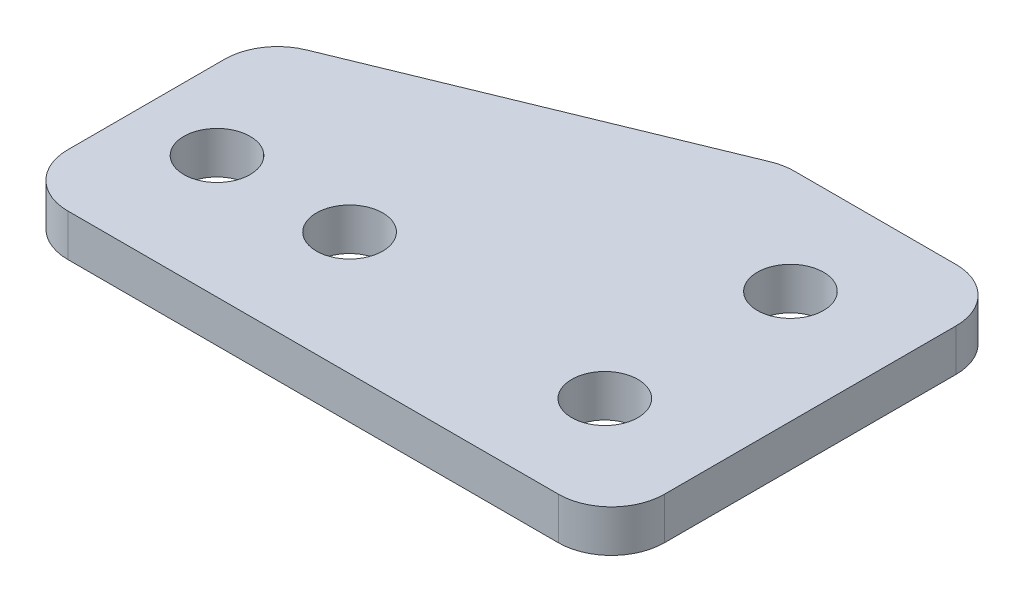
ISO-10303-21;
HEADER;
FILE_DESCRIPTION(('STEP AP214'),'2;1');
FILE_NAME('part.step','',(''),(''),'','','');
FILE_SCHEMA(('AUTOMOTIVE_DESIGN { 1 0 10303 214 1 1 1 1 }'));
ENDSEC;
DATA;
#1=APPLICATION_CONTEXT('core data for automotive mechanical design processes');
#2=APPLICATION_PROTOCOL_DEFINITION('international standard','automotive_design',2000,#1);
#3=PRODUCT_CONTEXT('',#1,'mechanical');
#4=PRODUCT('Part','Part','',(#3));
#5=PRODUCT_RELATED_PRODUCT_CATEGORY('part','',(#4));
#6=PRODUCT_DEFINITION_FORMATION('','',#4);
#7=PRODUCT_DEFINITION_CONTEXT('part definition',#1,'design');
#8=PRODUCT_DEFINITION('design','',#6,#7);
#9=PRODUCT_DEFINITION_SHAPE('','',#8);
#10=(LENGTH_UNIT() NAMED_UNIT(*) SI_UNIT(.MILLI.,.METRE.));
#11=(NAMED_UNIT(*) PLANE_ANGLE_UNIT() SI_UNIT($,.RADIAN.));
#12=(NAMED_UNIT(*) SI_UNIT($,.STERADIAN.) SOLID_ANGLE_UNIT());
#13=UNCERTAINTY_MEASURE_WITH_UNIT(LENGTH_MEASURE(1.E-05),#10,'distance_accuracy_value','');
#14=(GEOMETRIC_REPRESENTATION_CONTEXT(3) GLOBAL_UNCERTAINTY_ASSIGNED_CONTEXT((#13)) GLOBAL_UNIT_ASSIGNED_CONTEXT((#10,
#11,#12)) REPRESENTATION_CONTEXT('',''));
#15=CARTESIAN_POINT('',(0.,0.,0.));
#16=DIRECTION('',(0.,0.,1.));
#17=DIRECTION('',(1.,0.,0.));
#18=AXIS2_PLACEMENT_3D('',#15,#16,#17);
#19=CARTESIAN_POINT('',(-14.,143.175,155.));
#20=DIRECTION('',(0.,1.,0.));
#21=DIRECTION('',(0.,0.,-1.));
#22=AXIS2_PLACEMENT_3D('',#19,#20,#21);
#23=PLANE('',#22);
#24=CARTESIAN_POINT('',(-30.5,143.175,160.75));
#25=DIRECTION('',(0.,-1.,0.));
#26=DIRECTION('',(-1.,0.,0.));
#27=AXIS2_PLACEMENT_3D('',#24,#25,#26);
#28=CIRCLE('',#27,2.5);
#29=CARTESIAN_POINT('',(-28.,143.175,160.75));
#30=VERTEX_POINT('',#29);
#31=EDGE_CURVE('E232',#30,#30,#28,.T.);
#32=ORIENTED_EDGE('',*,*,#31,.T.);
#33=EDGE_LOOP('',(#32));
#34=FACE_BOUND('',#33,.T.);
#35=CARTESIAN_POINT('',(-20.5,143.175,160.75));
#36=DIRECTION('',(0.,-1.,0.));
#37=DIRECTION('',(-1.,0.,0.));
#38=AXIS2_PLACEMENT_3D('',#35,#36,#37);
#39=CIRCLE('',#38,2.5);
#40=CARTESIAN_POINT('',(-18.,143.175,160.75));
#41=VERTEX_POINT('',#40);
#42=EDGE_CURVE('E191',#41,#41,#39,.T.);
#43=ORIENTED_EDGE('',*,*,#42,.T.);
#44=EDGE_LOOP('',(#43));
#45=FACE_BOUND('',#44,.T.);
#46=CARTESIAN_POINT('',(-1.27675647831893E-13,143.175,162.));
#47=DIRECTION('',(0.,-1.,0.));
#48=DIRECTION('',(-1.,0.,0.));
#49=AXIS2_PLACEMENT_3D('',#46,#47,#48);
#50=CIRCLE('',#49,2.5);
#51=CARTESIAN_POINT('',(2.49999999999988,143.175,162.));
#52=VERTEX_POINT('',#51);
#53=EDGE_CURVE('E190',#52,#52,#50,.T.);
#54=ORIENTED_EDGE('',*,*,#53,.T.);
#55=EDGE_LOOP('',(#54));
#56=FACE_BOUND('',#55,.T.);
#57=CARTESIAN_POINT('',(-1.17683640610267E-13,143.175,148.));
#58=DIRECTION('',(0.,-1.,0.));
#59=DIRECTION('',(-1.,0.,0.));
#60=AXIS2_PLACEMENT_3D('',#57,#58,#59);
#61=CIRCLE('',#60,2.5);
#62=CARTESIAN_POINT('',(2.49999999999988,143.175,148.));
#63=VERTEX_POINT('',#62);
#64=EDGE_CURVE('E149',#63,#63,#61,.T.);
#65=ORIENTED_EDGE('',*,*,#64,.T.);
#66=EDGE_LOOP('',(#65));
#67=FACE_BOUND('',#66,.T.);
#68=CARTESIAN_POINT('',(4.49999999999987,143.175,144.));
#69=DIRECTION('',(0.,-1.,0.));
#70=DIRECTION('',(0.707106781186546,0.,-0.707106781186549));
#71=AXIS2_PLACEMENT_3D('',#68,#69,#70);
#72=CIRCLE('',#71,4.);
#73=CARTESIAN_POINT('',(4.49999999999987,143.175,140.));
#74=VERTEX_POINT('',#73);
#75=CARTESIAN_POINT('',(8.49999999999987,143.175,144.));
#76=VERTEX_POINT('',#75);
#77=EDGE_CURVE('E198',#74,#76,#72,.T.);
#78=ORIENTED_EDGE('',*,*,#77,.F.);
#79=DIRECTION('',(-1.,0.,0.));
#80=VECTOR('',#79,1.);
#81=CARTESIAN_POINT('',(-8.50000000000011,143.175,140.));
#82=LINE('',#81,#80);
#83=CARTESIAN_POINT('',(-7.71056635292856,143.175,140.));
#84=VERTEX_POINT('',#83);
#85=EDGE_CURVE('E196',#74,#84,#82,.T.);
#86=ORIENTED_EDGE('',*,*,#85,.T.);
#87=CARTESIAN_POINT('',(-7.71056635292856,143.175,144.));
#88=DIRECTION('',(0.,-1.,0.));
#89=DIRECTION('',(-0.193623580203377,0.,-0.98107589369489));
#90=AXIS2_PLACEMENT_3D('',#87,#88,#89);
#91=CIRCLE('',#90,4.);
#92=CARTESIAN_POINT('',(-9.23024176883602,143.175,140.299920726486));
#93=VERTEX_POINT('',#92);
#94=EDGE_CURVE('E219',#93,#84,#91,.T.);
#95=ORIENTED_EDGE('',*,*,#94,.F.);
#96=DIRECTION('',(-0.925019818378453,0.,0.379918853976865));
#97=VECTOR('',#96,1.);
#98=CARTESIAN_POINT('',(-36.5,143.175,151.5));
#99=LINE('',#98,#97);
#100=CARTESIAN_POINT('',(-34.0196754159076,143.175,150.481295260105));
#101=VERTEX_POINT('',#100);
#102=EDGE_CURVE('E167',#93,#101,#99,.T.);
#103=ORIENTED_EDGE('',*,*,#102,.T.);
#104=CARTESIAN_POINT('',(-32.5,143.175,154.181374533619));
#105=DIRECTION('',(0.,-1.,0.));
#106=DIRECTION('',(-0.830637963849734,0.,-0.556812870730883));
#107=AXIS2_PLACEMENT_3D('',#104,#105,#106);
#108=CIRCLE('',#107,4.);
#109=CARTESIAN_POINT('',(-36.5,143.175,154.181374533619));
#110=VERTEX_POINT('',#109);
#111=EDGE_CURVE('E171',#110,#101,#108,.T.);
#112=ORIENTED_EDGE('',*,*,#111,.F.);
#113=DIRECTION('',(0.,0.,1.));
#114=VECTOR('',#113,1.);
#115=CARTESIAN_POINT('',(-36.5,143.175,170.));
#116=LINE('',#115,#114);
#117=CARTESIAN_POINT('',(-36.5,143.175,166.));
#118=VERTEX_POINT('',#117);
#119=EDGE_CURVE('E203',#110,#118,#116,.T.);
#120=ORIENTED_EDGE('',*,*,#119,.T.);
#121=CARTESIAN_POINT('',(-32.5,143.175,166.));
#122=DIRECTION('',(0.,-1.,0.));
#123=DIRECTION('',(-0.707106781186549,0.,0.707106781186546));
#124=AXIS2_PLACEMENT_3D('',#121,#122,#123);
#125=CIRCLE('',#124,4.);
#126=CARTESIAN_POINT('',(-32.5,143.175,170.));
#127=VERTEX_POINT('',#126);
#128=EDGE_CURVE('E280',#127,#118,#125,.T.);
#129=ORIENTED_EDGE('',*,*,#128,.F.);
#130=DIRECTION('',(1.,0.,0.));
#131=VECTOR('',#130,1.);
#132=CARTESIAN_POINT('',(8.49999999999987,143.175,170.));
#133=LINE('',#132,#131);
#134=CARTESIAN_POINT('',(4.49999999999987,143.175,170.));
#135=VERTEX_POINT('',#134);
#136=EDGE_CURVE('E11',#127,#135,#133,.T.);
#137=ORIENTED_EDGE('',*,*,#136,.T.);
#138=CARTESIAN_POINT('',(4.49999999999987,143.175,166.));
#139=DIRECTION('',(0.,-1.,0.));
#140=DIRECTION('',(0.707106781186549,0.,0.707106781186546));
#141=AXIS2_PLACEMENT_3D('',#138,#139,#140);
#142=CIRCLE('',#141,4.);
#143=CARTESIAN_POINT('',(8.49999999999987,143.175,166.));
#144=VERTEX_POINT('',#143);
#145=EDGE_CURVE('E207',#144,#135,#142,.T.);
#146=ORIENTED_EDGE('',*,*,#145,.F.);
#147=DIRECTION('',(0.,0.,-1.));
#148=VECTOR('',#147,1.);
#149=CARTESIAN_POINT('',(8.49999999999987,143.175,140.));
#150=LINE('',#149,#148);
#151=EDGE_CURVE('E277',#144,#76,#150,.T.);
#152=ORIENTED_EDGE('',*,*,#151,.T.);
#153=EDGE_LOOP('',(#78,#86,#95,#103,#112,#120,#129,#137,#146,#152));
#154=FACE_BOUND('',#153,.T.);
#155=ADVANCED_FACE('F17',(#34,#45,#56,#67,#154),#23,.T.);
#156=CARTESIAN_POINT('',(-36.5,140.,170.));
#157=DIRECTION('',(0.,0.,1.));
#158=DIRECTION('',(1.,0.,0.));
#159=AXIS2_PLACEMENT_3D('',#156,#157,#158);
#160=PLANE('',#159);
#161=DIRECTION('',(0.,-1.,0.));
#162=VECTOR('',#161,1.);
#163=CARTESIAN_POINT('',(4.49999999999987,140.,170.));
#164=LINE('',#163,#162);
#165=CARTESIAN_POINT('',(4.49999999999987,140.,170.));
#166=VERTEX_POINT('',#165);
#167=EDGE_CURVE('E226',#135,#166,#164,.T.);
#168=ORIENTED_EDGE('',*,*,#167,.F.);
#169=ORIENTED_EDGE('',*,*,#136,.F.);
#170=DIRECTION('',(0.,1.,0.));
#171=VECTOR('',#170,1.);
#172=CARTESIAN_POINT('',(-32.5,140.,170.));
#173=LINE('',#172,#171);
#174=CARTESIAN_POINT('',(-32.5,140.,170.));
#175=VERTEX_POINT('',#174);
#176=EDGE_CURVE('E245',#175,#127,#173,.T.);
#177=ORIENTED_EDGE('',*,*,#176,.F.);
#178=DIRECTION('',(-1.,0.,0.));
#179=VECTOR('',#178,1.);
#180=CARTESIAN_POINT('',(8.49999999999987,140.,170.));
#181=LINE('',#180,#179);
#182=EDGE_CURVE('E178',#166,#175,#181,.T.);
#183=ORIENTED_EDGE('',*,*,#182,.F.);
#184=EDGE_LOOP('',(#168,#169,#177,#183));
#185=FACE_BOUND('',#184,.T.);
#186=ADVANCED_FACE('F311',(#185),#160,.T.);
#187=CARTESIAN_POINT('',(-1.17683640610267E-13,140.,148.));
#188=DIRECTION('',(0.,1.,0.));
#189=DIRECTION('',(-1.,0.,0.));
#190=AXIS2_PLACEMENT_3D('',#187,#188,#189);
#191=CYLINDRICAL_SURFACE('',#190,2.5);
#192=ORIENTED_EDGE('',*,*,#64,.F.);
#193=DIRECTION('',(0.,-1.,0.));
#194=VECTOR('',#193,1.);
#195=CARTESIAN_POINT('',(2.49999999999988,140.,148.));
#196=LINE('',#195,#194);
#197=CARTESIAN_POINT('',(2.49999999999988,140.,148.));
#198=VERTEX_POINT('',#197);
#199=EDGE_CURVE('E28',#63,#198,#196,.T.);
#200=ORIENTED_EDGE('',*,*,#199,.T.);
#201=CARTESIAN_POINT('',(-1.17683640610267E-13,140.,148.));
#202=DIRECTION('',(0.,-1.,0.));
#203=DIRECTION('',(-1.,0.,0.));
#204=AXIS2_PLACEMENT_3D('',#201,#202,#203);
#205=CIRCLE('',#204,2.5);
#206=EDGE_CURVE('E148',#198,#198,#205,.T.);
#207=ORIENTED_EDGE('',*,*,#206,.T.);
#208=ORIENTED_EDGE('',*,*,#199,.F.);
#209=EDGE_LOOP('',(#192,#200,#207,#208));
#210=FACE_BOUND('',#209,.T.);
#211=ADVANCED_FACE('F146',(#210),#191,.F.);
#212=CARTESIAN_POINT('',(-1.27675647831893E-13,140.,162.));
#213=DIRECTION('',(0.,1.,0.));
#214=DIRECTION('',(-1.,0.,0.));
#215=AXIS2_PLACEMENT_3D('',#212,#213,#214);
#216=CYLINDRICAL_SURFACE('',#215,2.5);
#217=ORIENTED_EDGE('',*,*,#53,.F.);
#218=DIRECTION('',(0.,-1.,0.));
#219=VECTOR('',#218,1.);
#220=CARTESIAN_POINT('',(2.49999999999988,140.,162.));
#221=LINE('',#220,#219);
#222=CARTESIAN_POINT('',(2.49999999999988,140.,162.));
#223=VERTEX_POINT('',#222);
#224=EDGE_CURVE('E142',#52,#223,#221,.T.);
#225=ORIENTED_EDGE('',*,*,#224,.T.);
#226=CARTESIAN_POINT('',(-1.27675647831893E-13,140.,162.));
#227=DIRECTION('',(0.,-1.,0.));
#228=DIRECTION('',(-1.,0.,0.));
#229=AXIS2_PLACEMENT_3D('',#226,#227,#228);
#230=CIRCLE('',#229,2.5);
#231=EDGE_CURVE('E251',#223,#223,#230,.T.);
#232=ORIENTED_EDGE('',*,*,#231,.T.);
#233=ORIENTED_EDGE('',*,*,#224,.F.);
#234=EDGE_LOOP('',(#217,#225,#232,#233));
#235=FACE_BOUND('',#234,.T.);
#236=ADVANCED_FACE('F417',(#235),#216,.F.);
#237=CARTESIAN_POINT('',(-20.5,140.,160.75));
#238=DIRECTION('',(0.,1.,0.));
#239=DIRECTION('',(-1.,0.,0.));
#240=AXIS2_PLACEMENT_3D('',#237,#238,#239);
#241=CYLINDRICAL_SURFACE('',#240,2.5);
#242=ORIENTED_EDGE('',*,*,#42,.F.);
#243=DIRECTION('',(0.,-1.,0.));
#244=VECTOR('',#243,1.);
#245=CARTESIAN_POINT('',(-18.,140.,160.75));
#246=LINE('',#245,#244);
#247=CARTESIAN_POINT('',(-18.,140.,160.75));
#248=VERTEX_POINT('',#247);
#249=EDGE_CURVE('E187',#41,#248,#246,.T.);
#250=ORIENTED_EDGE('',*,*,#249,.T.);
#251=CARTESIAN_POINT('',(-20.5,140.,160.75));
#252=DIRECTION('',(0.,-1.,0.));
#253=DIRECTION('',(-1.,0.,0.));
#254=AXIS2_PLACEMENT_3D('',#251,#252,#253);
#255=CIRCLE('',#254,2.5);
#256=EDGE_CURVE('E239',#248,#248,#255,.T.);
#257=ORIENTED_EDGE('',*,*,#256,.T.);
#258=ORIENTED_EDGE('',*,*,#249,.F.);
#259=EDGE_LOOP('',(#242,#250,#257,#258));
#260=FACE_BOUND('',#259,.T.);
#261=ADVANCED_FACE('F411',(#260),#241,.F.);
#262=CARTESIAN_POINT('',(-30.5,140.,160.75));
#263=DIRECTION('',(0.,1.,0.));
#264=DIRECTION('',(-1.,0.,0.));
#265=AXIS2_PLACEMENT_3D('',#262,#263,#264);
#266=CYLINDRICAL_SURFACE('',#265,2.5);
#267=ORIENTED_EDGE('',*,*,#31,.F.);
#268=DIRECTION('',(0.,-1.,0.));
#269=VECTOR('',#268,1.);
#270=CARTESIAN_POINT('',(-28.,140.,160.75));
#271=LINE('',#270,#269);
#272=CARTESIAN_POINT('',(-28.,140.,160.75));
#273=VERTEX_POINT('',#272);
#274=EDGE_CURVE('E229',#30,#273,#271,.T.);
#275=ORIENTED_EDGE('',*,*,#274,.T.);
#276=CARTESIAN_POINT('',(-30.5,140.,160.75));
#277=DIRECTION('',(0.,-1.,0.));
#278=DIRECTION('',(-1.,0.,0.));
#279=AXIS2_PLACEMENT_3D('',#276,#277,#278);
#280=CIRCLE('',#279,2.5);
#281=EDGE_CURVE('E235',#273,#273,#280,.T.);
#282=ORIENTED_EDGE('',*,*,#281,.T.);
#283=ORIENTED_EDGE('',*,*,#274,.F.);
#284=EDGE_LOOP('',(#267,#275,#282,#283));
#285=FACE_BOUND('',#284,.T.);
#286=ADVANCED_FACE('F416',(#285),#266,.F.);
#287=CARTESIAN_POINT('',(-32.5,140.,166.));
#288=DIRECTION('',(0.,1.,0.));
#289=DIRECTION('',(-0.707106781186549,0.,0.707106781186546));
#290=AXIS2_PLACEMENT_3D('',#287,#288,#289);
#291=CYLINDRICAL_SURFACE('',#290,4.);
#292=ORIENTED_EDGE('',*,*,#128,.T.);
#293=DIRECTION('',(0.,-1.,0.));
#294=VECTOR('',#293,1.);
#295=CARTESIAN_POINT('',(-36.5,140.,166.));
#296=LINE('',#295,#294);
#297=CARTESIAN_POINT('',(-36.5,140.,166.));
#298=VERTEX_POINT('',#297);
#299=EDGE_CURVE('E186',#118,#298,#296,.T.);
#300=ORIENTED_EDGE('',*,*,#299,.T.);
#301=CARTESIAN_POINT('',(-32.5,140.,166.));
#302=DIRECTION('',(0.,1.,0.));
#303=DIRECTION('',(-0.707106781186549,0.,0.707106781186546));
#304=AXIS2_PLACEMENT_3D('',#301,#302,#303);
#305=CIRCLE('',#304,4.);
#306=EDGE_CURVE('E173',#298,#175,#305,.T.);
#307=ORIENTED_EDGE('',*,*,#306,.T.);
#308=ORIENTED_EDGE('',*,*,#176,.T.);
#309=EDGE_LOOP('',(#292,#300,#307,#308));
#310=FACE_BOUND('',#309,.T.);
#311=ADVANCED_FACE('F19',(#310),#291,.T.);
#312=CARTESIAN_POINT('',(8.49999999999987,140.,170.));
#313=DIRECTION('',(1.,0.,0.));
#314=DIRECTION('',(0.,0.,-1.));
#315=AXIS2_PLACEMENT_3D('',#312,#313,#314);
#316=PLANE('',#315);
#317=DIRECTION('',(0.,-1.,0.));
#318=VECTOR('',#317,1.);
#319=CARTESIAN_POINT('',(8.49999999999987,140.,144.));
#320=LINE('',#319,#318);
#321=CARTESIAN_POINT('',(8.49999999999987,140.,144.));
#322=VERTEX_POINT('',#321);
#323=EDGE_CURVE('E202',#76,#322,#320,.T.);
#324=ORIENTED_EDGE('',*,*,#323,.F.);
#325=ORIENTED_EDGE('',*,*,#151,.F.);
#326=DIRECTION('',(0.,1.,0.));
#327=VECTOR('',#326,1.);
#328=CARTESIAN_POINT('',(8.49999999999987,140.,166.));
#329=LINE('',#328,#327);
#330=CARTESIAN_POINT('',(8.49999999999987,140.,166.));
#331=VERTEX_POINT('',#330);
#332=EDGE_CURVE('E159',#331,#144,#329,.T.);
#333=ORIENTED_EDGE('',*,*,#332,.F.);
#334=DIRECTION('',(0.,0.,1.));
#335=VECTOR('',#334,1.);
#336=CARTESIAN_POINT('',(8.49999999999987,140.,140.));
#337=LINE('',#336,#335);
#338=EDGE_CURVE('E255',#322,#331,#337,.T.);
#339=ORIENTED_EDGE('',*,*,#338,.F.);
#340=EDGE_LOOP('',(#324,#325,#333,#339));
#341=FACE_BOUND('',#340,.T.);
#342=ADVANCED_FACE('F318',(#341),#316,.T.);
#343=CARTESIAN_POINT('',(4.49999999999987,140.,166.));
#344=DIRECTION('',(0.,1.,0.));
#345=DIRECTION('',(0.707106781186549,0.,0.707106781186546));
#346=AXIS2_PLACEMENT_3D('',#343,#344,#345);
#347=CYLINDRICAL_SURFACE('',#346,4.);
#348=ORIENTED_EDGE('',*,*,#145,.T.);
#349=ORIENTED_EDGE('',*,*,#167,.T.);
#350=CARTESIAN_POINT('',(4.49999999999987,140.,166.));
#351=DIRECTION('',(0.,1.,0.));
#352=DIRECTION('',(0.707106781186549,0.,0.707106781186546));
#353=AXIS2_PLACEMENT_3D('',#350,#351,#352);
#354=CIRCLE('',#353,4.);
#355=EDGE_CURVE('E21',#166,#331,#354,.T.);
#356=ORIENTED_EDGE('',*,*,#355,.T.);
#357=ORIENTED_EDGE('',*,*,#332,.T.);
#358=EDGE_LOOP('',(#348,#349,#356,#357));
#359=FACE_BOUND('',#358,.T.);
#360=ADVANCED_FACE('F314',(#359),#347,.T.);
#361=CARTESIAN_POINT('',(-36.5,140.,151.5));
#362=DIRECTION('',(-1.,0.,0.));
#363=DIRECTION('',(0.,1.,0.));
#364=AXIS2_PLACEMENT_3D('',#361,#362,#363);
#365=PLANE('',#364);
#366=DIRECTION('',(0.,1.,0.));
#367=VECTOR('',#366,1.);
#368=CARTESIAN_POINT('',(-36.5,140.,154.181374533619));
#369=LINE('',#368,#367);
#370=CARTESIAN_POINT('',(-36.5,140.,154.181374533619));
#371=VERTEX_POINT('',#370);
#372=EDGE_CURVE('E182',#371,#110,#369,.T.);
#373=ORIENTED_EDGE('',*,*,#372,.F.);
#374=DIRECTION('',(0.,0.,-1.));
#375=VECTOR('',#374,1.);
#376=CARTESIAN_POINT('',(-36.5,140.,170.));
#377=LINE('',#376,#375);
#378=EDGE_CURVE('E177',#298,#371,#377,.T.);
#379=ORIENTED_EDGE('',*,*,#378,.F.);
#380=ORIENTED_EDGE('',*,*,#299,.F.);
#381=ORIENTED_EDGE('',*,*,#119,.F.);
#382=EDGE_LOOP('',(#373,#379,#380,#381));
#383=FACE_BOUND('',#382,.T.);
#384=ADVANCED_FACE('F308',(#383),#365,.T.);
#385=CARTESIAN_POINT('',(-32.5,140.,154.181374533619));
#386=DIRECTION('',(0.,1.,0.));
#387=DIRECTION('',(-0.830637963849734,0.,-0.556812870730883));
#388=AXIS2_PLACEMENT_3D('',#385,#386,#387);
#389=CYLINDRICAL_SURFACE('',#388,4.);
#390=ORIENTED_EDGE('',*,*,#111,.T.);
#391=DIRECTION('',(0.,-1.,0.));
#392=VECTOR('',#391,1.);
#393=CARTESIAN_POINT('',(-34.0196754159076,140.,150.481295260105));
#394=LINE('',#393,#392);
#395=CARTESIAN_POINT('',(-34.0196754159076,140.,150.481295260105));
#396=VERTEX_POINT('',#395);
#397=EDGE_CURVE('E172',#101,#396,#394,.T.);
#398=ORIENTED_EDGE('',*,*,#397,.T.);
#399=CARTESIAN_POINT('',(-32.5,140.,154.181374533619));
#400=DIRECTION('',(0.,1.,0.));
#401=DIRECTION('',(-0.830637963849734,0.,-0.556812870730883));
#402=AXIS2_PLACEMENT_3D('',#399,#400,#401);
#403=CIRCLE('',#402,4.);
#404=EDGE_CURVE('E166',#396,#371,#403,.T.);
#405=ORIENTED_EDGE('',*,*,#404,.T.);
#406=ORIENTED_EDGE('',*,*,#372,.T.);
#407=EDGE_LOOP('',(#390,#398,#405,#406));
#408=FACE_BOUND('',#407,.T.);
#409=ADVANCED_FACE('F387',(#408),#389,.T.);
#410=CARTESIAN_POINT('',(-8.50000000000011,140.,140.));
#411=DIRECTION('',(-0.379918853976865,0.,-0.925019818378453));
#412=DIRECTION('',(-0.925019818378453,0.,0.379918853976865));
#413=AXIS2_PLACEMENT_3D('',#410,#411,#412);
#414=PLANE('',#413);
#415=DIRECTION('',(0.,1.,0.));
#416=VECTOR('',#415,1.);
#417=CARTESIAN_POINT('',(-9.23024176883602,140.,140.299920726486));
#418=LINE('',#417,#416);
#419=CARTESIAN_POINT('',(-9.23024176883602,140.,140.299920726486));
#420=VERTEX_POINT('',#419);
#421=EDGE_CURVE('E215',#420,#93,#418,.T.);
#422=ORIENTED_EDGE('',*,*,#421,.F.);
#423=DIRECTION('',(0.925019818378453,0.,-0.379918853976865));
#424=VECTOR('',#423,1.);
#425=CARTESIAN_POINT('',(-36.5,140.,151.5));
#426=LINE('',#425,#424);
#427=EDGE_CURVE('E161',#396,#420,#426,.T.);
#428=ORIENTED_EDGE('',*,*,#427,.F.);
#429=ORIENTED_EDGE('',*,*,#397,.F.);
#430=ORIENTED_EDGE('',*,*,#102,.F.);
#431=EDGE_LOOP('',(#422,#428,#429,#430));
#432=FACE_BOUND('',#431,.T.);
#433=ADVANCED_FACE('F381',(#432),#414,.T.);
#434=CARTESIAN_POINT('',(-7.71056635292856,140.,144.));
#435=DIRECTION('',(0.,1.,0.));
#436=DIRECTION('',(-0.193623580203377,0.,-0.98107589369489));
#437=AXIS2_PLACEMENT_3D('',#434,#435,#436);
#438=CYLINDRICAL_SURFACE('',#437,4.);
#439=ORIENTED_EDGE('',*,*,#94,.T.);
#440=DIRECTION('',(0.,-1.,0.));
#441=VECTOR('',#440,1.);
#442=CARTESIAN_POINT('',(-7.71056635292856,140.,140.));
#443=LINE('',#442,#441);
#444=CARTESIAN_POINT('',(-7.71056635292856,140.,140.));
#445=VERTEX_POINT('',#444);
#446=EDGE_CURVE('E192',#84,#445,#443,.T.);
#447=ORIENTED_EDGE('',*,*,#446,.T.);
#448=CARTESIAN_POINT('',(-7.71056635292856,140.,144.));
#449=DIRECTION('',(0.,1.,0.));
#450=DIRECTION('',(-0.193623580203377,0.,-0.98107589369489));
#451=AXIS2_PLACEMENT_3D('',#448,#449,#450);
#452=CIRCLE('',#451,4.);
#453=EDGE_CURVE('E165',#445,#420,#452,.T.);
#454=ORIENTED_EDGE('',*,*,#453,.T.);
#455=ORIENTED_EDGE('',*,*,#421,.T.);
#456=EDGE_LOOP('',(#439,#447,#454,#455));
#457=FACE_BOUND('',#456,.T.);
#458=ADVANCED_FACE('F386',(#457),#438,.T.);
#459=CARTESIAN_POINT('',(-14.,140.,155.));
#460=DIRECTION('',(0.,1.,0.));
#461=DIRECTION('',(0.,0.,-1.));
#462=AXIS2_PLACEMENT_3D('',#459,#460,#461);
#463=PLANE('',#462);
#464=ORIENTED_EDGE('',*,*,#206,.F.);
#465=EDGE_LOOP('',(#464));
#466=FACE_BOUND('',#465,.T.);
#467=ORIENTED_EDGE('',*,*,#231,.F.);
#468=EDGE_LOOP('',(#467));
#469=FACE_BOUND('',#468,.T.);
#470=ORIENTED_EDGE('',*,*,#256,.F.);
#471=EDGE_LOOP('',(#470));
#472=FACE_BOUND('',#471,.T.);
#473=ORIENTED_EDGE('',*,*,#281,.F.);
#474=EDGE_LOOP('',(#473));
#475=FACE_BOUND('',#474,.T.);
#476=CARTESIAN_POINT('',(4.49999999999987,140.,144.));
#477=DIRECTION('',(0.,1.,0.));
#478=DIRECTION('',(0.707106781186546,0.,-0.707106781186549));
#479=AXIS2_PLACEMENT_3D('',#476,#477,#478);
#480=CIRCLE('',#479,4.);
#481=CARTESIAN_POINT('',(4.49999999999987,140.,140.));
#482=VERTEX_POINT('',#481);
#483=EDGE_CURVE('E210',#322,#482,#480,.T.);
#484=ORIENTED_EDGE('',*,*,#483,.F.);
#485=ORIENTED_EDGE('',*,*,#338,.T.);
#486=ORIENTED_EDGE('',*,*,#355,.F.);
#487=ORIENTED_EDGE('',*,*,#182,.T.);
#488=ORIENTED_EDGE('',*,*,#306,.F.);
#489=ORIENTED_EDGE('',*,*,#378,.T.);
#490=ORIENTED_EDGE('',*,*,#404,.F.);
#491=ORIENTED_EDGE('',*,*,#427,.T.);
#492=ORIENTED_EDGE('',*,*,#453,.F.);
#493=DIRECTION('',(1.,0.,0.));
#494=VECTOR('',#493,1.);
#495=CARTESIAN_POINT('',(-8.50000000000011,140.,140.));
#496=LINE('',#495,#494);
#497=EDGE_CURVE('E197',#445,#482,#496,.T.);
#498=ORIENTED_EDGE('',*,*,#497,.T.);
#499=EDGE_LOOP('',(#484,#485,#486,#487,#488,#489,#490,#491,#492,#498));
#500=FACE_BOUND('',#499,.T.);
#501=ADVANCED_FACE('F310',(#466,#469,#472,#475,#500),#463,.F.);
#502=CARTESIAN_POINT('',(8.49999999999987,140.,140.));
#503=DIRECTION('',(0.,0.,-1.));
#504=DIRECTION('',(-1.,0.,0.));
#505=AXIS2_PLACEMENT_3D('',#502,#503,#504);
#506=PLANE('',#505);
#507=DIRECTION('',(0.,1.,0.));
#508=VECTOR('',#507,1.);
#509=CARTESIAN_POINT('',(4.49999999999987,140.,140.));
#510=LINE('',#509,#508);
#511=EDGE_CURVE('E214',#482,#74,#510,.T.);
#512=ORIENTED_EDGE('',*,*,#511,.F.);
#513=ORIENTED_EDGE('',*,*,#497,.F.);
#514=ORIENTED_EDGE('',*,*,#446,.F.);
#515=ORIENTED_EDGE('',*,*,#85,.F.);
#516=EDGE_LOOP('',(#512,#513,#514,#515));
#517=FACE_BOUND('',#516,.T.);
#518=ADVANCED_FACE('F349',(#517),#506,.T.);
#519=CARTESIAN_POINT('',(4.49999999999987,140.,144.));
#520=DIRECTION('',(0.,1.,0.));
#521=DIRECTION('',(0.707106781186546,0.,-0.707106781186549));
#522=AXIS2_PLACEMENT_3D('',#519,#520,#521);
#523=CYLINDRICAL_SURFACE('',#522,4.);
#524=ORIENTED_EDGE('',*,*,#77,.T.);
#525=ORIENTED_EDGE('',*,*,#323,.T.);
#526=ORIENTED_EDGE('',*,*,#483,.T.);
#527=ORIENTED_EDGE('',*,*,#511,.T.);
#528=EDGE_LOOP('',(#524,#525,#526,#527));
#529=FACE_BOUND('',#528,.T.);
#530=ADVANCED_FACE('F321',(#529),#523,.T.);
#531=CLOSED_SHELL('',(#155,#186,#211,#236,#261,#286,#311,#342,#360,#384,#409,#433,#458,#501,
#518,#530));
#532=MANIFOLD_SOLID_BREP('B1',#531);
#533=ADVANCED_BREP_SHAPE_REPRESENTATION('',(#18,#532),#14);
#534=SHAPE_DEFINITION_REPRESENTATION(#9,#533);
ENDSEC;
END-ISO-10303-21;
